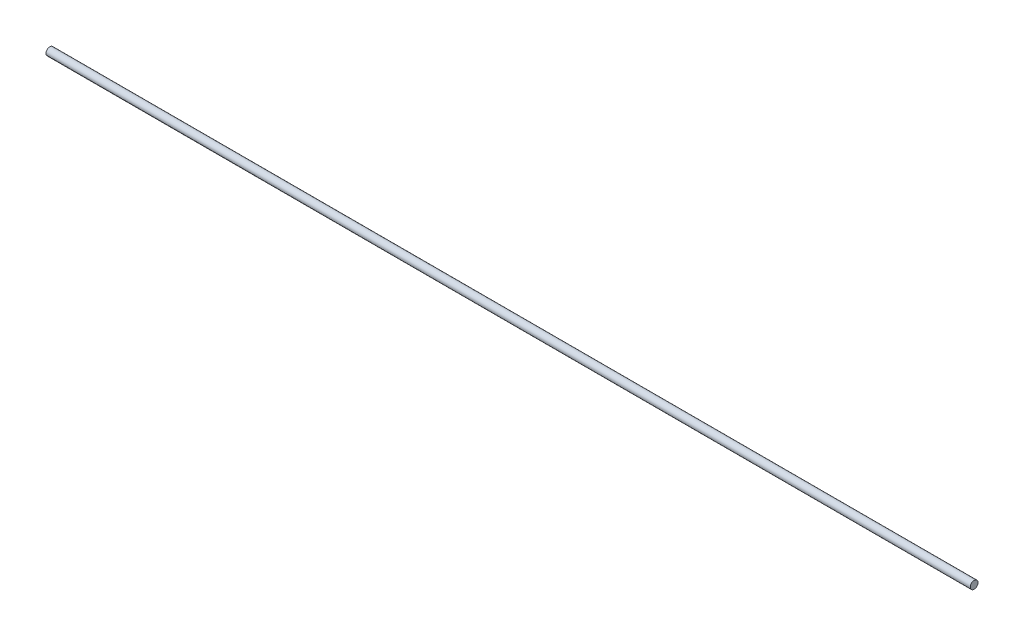
ISO-10303-21;
HEADER;
FILE_DESCRIPTION(('STEP AP214'),'2;1');
FILE_NAME('part.step','',(''),(''),'','','');
FILE_SCHEMA(('AUTOMOTIVE_DESIGN { 1 0 10303 214 1 1 1 1 }'));
ENDSEC;
DATA;
#1=APPLICATION_CONTEXT('core data for automotive mechanical design processes');
#2=APPLICATION_PROTOCOL_DEFINITION('international standard','automotive_design',2000,#1);
#3=PRODUCT_CONTEXT('',#1,'mechanical');
#4=PRODUCT('Part','Part','',(#3));
#5=PRODUCT_RELATED_PRODUCT_CATEGORY('part','',(#4));
#6=PRODUCT_DEFINITION_FORMATION('','',#4);
#7=PRODUCT_DEFINITION_CONTEXT('part definition',#1,'design');
#8=PRODUCT_DEFINITION('design','',#6,#7);
#9=PRODUCT_DEFINITION_SHAPE('','',#8);
#10=(LENGTH_UNIT() NAMED_UNIT(*) SI_UNIT(.MILLI.,.METRE.));
#11=(NAMED_UNIT(*) PLANE_ANGLE_UNIT() SI_UNIT($,.RADIAN.));
#12=(NAMED_UNIT(*) SI_UNIT($,.STERADIAN.) SOLID_ANGLE_UNIT());
#13=UNCERTAINTY_MEASURE_WITH_UNIT(LENGTH_MEASURE(1.E-05),#10,'distance_accuracy_value','');
#14=(GEOMETRIC_REPRESENTATION_CONTEXT(3) GLOBAL_UNCERTAINTY_ASSIGNED_CONTEXT((#13)) GLOBAL_UNIT_ASSIGNED_CONTEXT((#10,
#11,#12)) REPRESENTATION_CONTEXT('',''));
#15=CARTESIAN_POINT('',(0.,0.,0.));
#16=DIRECTION('',(0.,0.,1.));
#17=DIRECTION('',(1.,0.,0.));
#18=AXIS2_PLACEMENT_3D('',#15,#16,#17);
#19=CARTESIAN_POINT('',(-28.5027726432532,0.,-5.21256931608133));
#20=DIRECTION('',(1.,0.,0.));
#21=DIRECTION('',(0.,0.,-1.));
#22=AXIS2_PLACEMENT_3D('',#19,#20,#21);
#23=PLANE('',#22);
#24=CARTESIAN_POINT('',(-28.5027726432532,0.,-4.96256931608133));
#25=DIRECTION('',(-1.,0.,0.));
#26=DIRECTION('',(0.,0.,1.));
#27=AXIS2_PLACEMENT_3D('',#24,#25,#26);
#28=CIRCLE('',#27,0.25);
#29=CARTESIAN_POINT('',(-28.5027726432532,0.,-4.71256931608133));
#30=VERTEX_POINT('',#29);
#31=EDGE_CURVE('E37',#30,#30,#28,.T.);
#32=ORIENTED_EDGE('',*,*,#31,.T.);
#33=EDGE_LOOP('',(#32));
#34=FACE_BOUND('',#33,.T.);
#35=ADVANCED_FACE('F31',(#34),#23,.F.);
#36=CARTESIAN_POINT('',(31.4972273567468,0.,-5.21256931608133));
#37=DIRECTION('',(-1.,0.,0.));
#38=DIRECTION('',(0.,0.,1.));
#39=AXIS2_PLACEMENT_3D('',#36,#37,#38);
#40=PLANE('',#39);
#41=CARTESIAN_POINT('',(31.4972273567468,0.,-4.96256931608133));
#42=DIRECTION('',(-1.,0.,0.));
#43=DIRECTION('',(0.,0.,1.));
#44=AXIS2_PLACEMENT_3D('',#41,#42,#43);
#45=CIRCLE('',#44,0.25);
#46=CARTESIAN_POINT('',(31.4972273567468,0.,-4.71256931608133));
#47=VERTEX_POINT('',#46);
#48=EDGE_CURVE('E10',#47,#47,#45,.T.);
#49=ORIENTED_EDGE('',*,*,#48,.F.);
#50=EDGE_LOOP('',(#49));
#51=FACE_BOUND('',#50,.T.);
#52=ADVANCED_FACE('F46',(#51),#40,.F.);
#53=CARTESIAN_POINT('',(-28.5027726432532,0.,-4.96256931608133));
#54=DIRECTION('',(-1.,0.,0.));
#55=DIRECTION('',(0.,0.,1.));
#56=AXIS2_PLACEMENT_3D('',#53,#54,#55);
#57=CYLINDRICAL_SURFACE('',#56,0.25);
#58=ORIENTED_EDGE('',*,*,#31,.F.);
#59=EDGE_LOOP('',(#58));
#60=FACE_BOUND('',#59,.T.);
#61=ORIENTED_EDGE('',*,*,#48,.T.);
#62=EDGE_LOOP('',(#61));
#63=FACE_BOUND('',#62,.T.);
#64=ADVANCED_FACE('F44',(#60,#63),#57,.T.);
#65=CLOSED_SHELL('',(#35,#52,#64));
#66=MANIFOLD_SOLID_BREP('B2',#65);
#67=ADVANCED_BREP_SHAPE_REPRESENTATION('',(#18,#66),#14);
#68=SHAPE_DEFINITION_REPRESENTATION(#9,#67);
ENDSEC;
END-ISO-10303-21;
